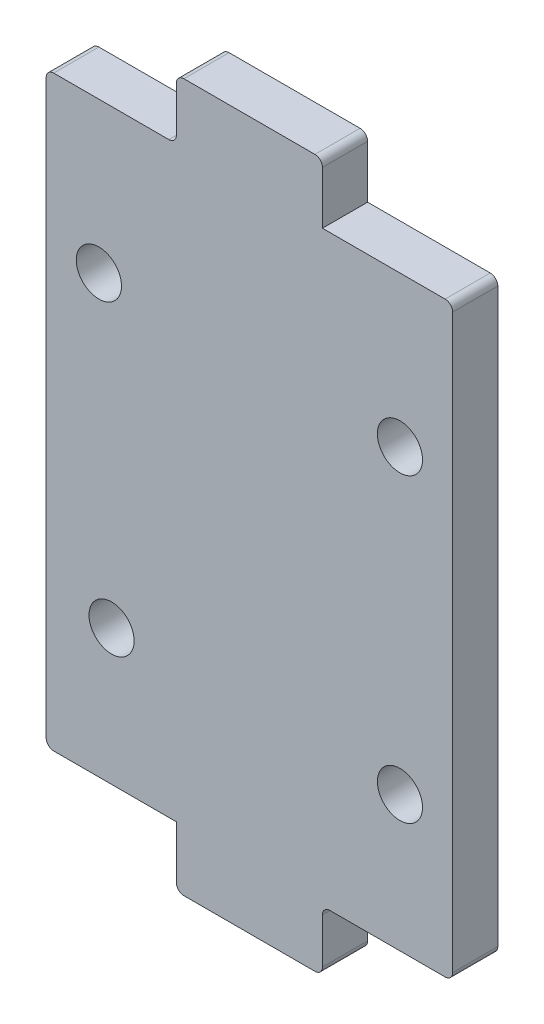
ISO-10303-21;
HEADER;
FILE_DESCRIPTION(('STEP AP214'),'2;1');
FILE_NAME('part.step','',(''),(''),'','','');
FILE_SCHEMA(('AUTOMOTIVE_DESIGN { 1 0 10303 214 1 1 1 1 }'));
ENDSEC;
DATA;
#1=APPLICATION_CONTEXT('core data for automotive mechanical design processes');
#2=APPLICATION_PROTOCOL_DEFINITION('international standard','automotive_design',2000,#1);
#3=PRODUCT_CONTEXT('',#1,'mechanical');
#4=PRODUCT('Part','Part','',(#3));
#5=PRODUCT_RELATED_PRODUCT_CATEGORY('part','',(#4));
#6=PRODUCT_DEFINITION_FORMATION('','',#4);
#7=PRODUCT_DEFINITION_CONTEXT('part definition',#1,'design');
#8=PRODUCT_DEFINITION('design','',#6,#7);
#9=PRODUCT_DEFINITION_SHAPE('','',#8);
#10=(LENGTH_UNIT() NAMED_UNIT(*) SI_UNIT(.MILLI.,.METRE.));
#11=(NAMED_UNIT(*) PLANE_ANGLE_UNIT() SI_UNIT($,.RADIAN.));
#12=(NAMED_UNIT(*) SI_UNIT($,.STERADIAN.) SOLID_ANGLE_UNIT());
#13=UNCERTAINTY_MEASURE_WITH_UNIT(LENGTH_MEASURE(1.E-05),#10,'distance_accuracy_value','');
#14=(GEOMETRIC_REPRESENTATION_CONTEXT(3) GLOBAL_UNCERTAINTY_ASSIGNED_CONTEXT((#13)) GLOBAL_UNIT_ASSIGNED_CONTEXT((#10,
#11,#12)) REPRESENTATION_CONTEXT('',''));
#15=CARTESIAN_POINT('',(0.,0.,0.));
#16=DIRECTION('',(0.,0.,1.));
#17=DIRECTION('',(1.,0.,0.));
#18=AXIS2_PLACEMENT_3D('',#15,#16,#17);
#19=CARTESIAN_POINT('',(0.,0.,3.));
#20=DIRECTION('',(0.,0.,-1.));
#21=DIRECTION('',(-1.,0.,0.));
#22=AXIS2_PLACEMENT_3D('',#19,#20,#21);
#23=PLANE('',#22);
#24=DIRECTION('',(-1.,0.,0.));
#25=VECTOR('',#24,1.);
#26=CARTESIAN_POINT('',(-13.5,19.5,3.));
#27=LINE('',#26,#25);
#28=CARTESIAN_POINT('',(-5.35133506975398,19.5,3.));
#29=VERTEX_POINT('',#28);
#30=CARTESIAN_POINT('',(-13.,19.5,3.));
#31=VERTEX_POINT('',#30);
#32=EDGE_CURVE('E234',#29,#31,#27,.T.);
#33=ORIENTED_EDGE('',*,*,#32,.T.);
#34=CARTESIAN_POINT('',(-13.,19.,3.));
#35=DIRECTION('',(0.,0.,-1.));
#36=DIRECTION('',(-1.,0.,0.));
#37=AXIS2_PLACEMENT_3D('',#34,#35,#36);
#38=CIRCLE('',#37,0.5);
#39=CARTESIAN_POINT('',(-13.5,19.,3.));
#40=VERTEX_POINT('',#39);
#41=EDGE_CURVE('E307',#31,#40,#38,.F.);
#42=ORIENTED_EDGE('',*,*,#41,.T.);
#43=DIRECTION('',(0.,-1.,0.));
#44=VECTOR('',#43,1.);
#45=CARTESIAN_POINT('',(-13.5,19.5,3.));
#46=LINE('',#45,#44);
#47=CARTESIAN_POINT('',(-13.5,-19.,3.));
#48=VERTEX_POINT('',#47);
#49=EDGE_CURVE('E194',#40,#48,#46,.T.);
#50=ORIENTED_EDGE('',*,*,#49,.T.);
#51=CARTESIAN_POINT('',(-13.,-19.,3.));
#52=DIRECTION('',(0.,0.,-1.));
#53=DIRECTION('',(-1.,0.,0.));
#54=AXIS2_PLACEMENT_3D('',#51,#52,#53);
#55=CIRCLE('',#54,0.5);
#56=CARTESIAN_POINT('',(-13.,-19.5,3.));
#57=VERTEX_POINT('',#56);
#58=EDGE_CURVE('E190',#48,#57,#55,.F.);
#59=ORIENTED_EDGE('',*,*,#58,.T.);
#60=DIRECTION('',(1.,0.,0.));
#61=VECTOR('',#60,1.);
#62=CARTESIAN_POINT('',(-4.85133506975397,-19.5,3.));
#63=LINE('',#62,#61);
#64=CARTESIAN_POINT('',(-4.85133506975397,-19.5,3.));
#65=VERTEX_POINT('',#64);
#66=EDGE_CURVE('E181',#57,#65,#63,.T.);
#67=ORIENTED_EDGE('',*,*,#66,.T.);
#68=DIRECTION('',(0.,-1.,0.));
#69=VECTOR('',#68,1.);
#70=CARTESIAN_POINT('',(-4.85133506975397,-19.5,3.));
#71=LINE('',#70,#69);
#72=CARTESIAN_POINT('',(-4.85133506975398,-23.,3.));
#73=VERTEX_POINT('',#72);
#74=EDGE_CURVE('E186',#65,#73,#71,.T.);
#75=ORIENTED_EDGE('',*,*,#74,.T.);
#76=CARTESIAN_POINT('',(-4.35133506975398,-23.,3.));
#77=DIRECTION('',(0.,0.,-1.));
#78=DIRECTION('',(-1.,0.,0.));
#79=AXIS2_PLACEMENT_3D('',#76,#77,#78);
#80=CIRCLE('',#79,0.5);
#81=CARTESIAN_POINT('',(-4.35133506975398,-23.5,3.));
#82=VERTEX_POINT('',#81);
#83=EDGE_CURVE('E301',#73,#82,#80,.F.);
#84=ORIENTED_EDGE('',*,*,#83,.T.);
#85=DIRECTION('',(1.,0.,0.));
#86=VECTOR('',#85,1.);
#87=CARTESIAN_POINT('',(-4.85133506975398,-23.5,3.));
#88=LINE('',#87,#86);
#89=CARTESIAN_POINT('',(4.35133506975397,-23.5,3.));
#90=VERTEX_POINT('',#89);
#91=EDGE_CURVE('E210',#82,#90,#88,.T.);
#92=ORIENTED_EDGE('',*,*,#91,.T.);
#93=CARTESIAN_POINT('',(4.35133506975398,-23.,3.));
#94=DIRECTION('',(0.,0.,-1.));
#95=DIRECTION('',(-1.,0.,0.));
#96=AXIS2_PLACEMENT_3D('',#93,#94,#95);
#97=CIRCLE('',#96,0.5);
#98=CARTESIAN_POINT('',(4.85133506975398,-23.,3.));
#99=VERTEX_POINT('',#98);
#100=EDGE_CURVE('E299',#90,#99,#97,.F.);
#101=ORIENTED_EDGE('',*,*,#100,.T.);
#102=DIRECTION('',(0.,1.,0.));
#103=VECTOR('',#102,1.);
#104=CARTESIAN_POINT('',(4.85133506975398,-23.5,3.));
#105=LINE('',#104,#103);
#106=CARTESIAN_POINT('',(4.85133506975397,-20.,3.));
#107=VERTEX_POINT('',#106);
#108=EDGE_CURVE('E213',#99,#107,#105,.T.);
#109=ORIENTED_EDGE('',*,*,#108,.T.);
#110=CARTESIAN_POINT('',(5.35133506975397,-20.,3.));
#111=DIRECTION('',(0.,0.,-1.));
#112=DIRECTION('',(-1.,0.,0.));
#113=AXIS2_PLACEMENT_3D('',#110,#111,#112);
#114=CIRCLE('',#113,0.5);
#115=CARTESIAN_POINT('',(5.35133506975397,-19.5,3.));
#116=VERTEX_POINT('',#115);
#117=EDGE_CURVE('E348',#107,#116,#114,.T.);
#118=ORIENTED_EDGE('',*,*,#117,.T.);
#119=DIRECTION('',(1.,0.,0.));
#120=VECTOR('',#119,1.);
#121=CARTESIAN_POINT('',(4.85133506975397,-19.5,3.));
#122=LINE('',#121,#120);
#123=CARTESIAN_POINT('',(13.,-19.5,3.));
#124=VERTEX_POINT('',#123);
#125=EDGE_CURVE('E219',#116,#124,#122,.T.);
#126=ORIENTED_EDGE('',*,*,#125,.T.);
#127=CARTESIAN_POINT('',(13.,-19.,3.));
#128=DIRECTION('',(0.,0.,-1.));
#129=DIRECTION('',(-1.,0.,0.));
#130=AXIS2_PLACEMENT_3D('',#127,#128,#129);
#131=CIRCLE('',#130,0.5);
#132=CARTESIAN_POINT('',(13.5,-19.,3.));
#133=VERTEX_POINT('',#132);
#134=EDGE_CURVE('E297',#124,#133,#131,.F.);
#135=ORIENTED_EDGE('',*,*,#134,.T.);
#136=DIRECTION('',(0.,1.,0.));
#137=VECTOR('',#136,1.);
#138=CARTESIAN_POINT('',(13.5,19.5,3.));
#139=LINE('',#138,#137);
#140=CARTESIAN_POINT('',(13.5,19.,3.));
#141=VERTEX_POINT('',#140);
#142=EDGE_CURVE('E222',#133,#141,#139,.T.);
#143=ORIENTED_EDGE('',*,*,#142,.T.);
#144=CARTESIAN_POINT('',(13.,19.,3.));
#145=DIRECTION('',(0.,0.,-1.));
#146=DIRECTION('',(-1.,0.,0.));
#147=AXIS2_PLACEMENT_3D('',#144,#145,#146);
#148=CIRCLE('',#147,0.5);
#149=CARTESIAN_POINT('',(13.,19.5,3.));
#150=VERTEX_POINT('',#149);
#151=EDGE_CURVE('E295',#141,#150,#148,.F.);
#152=ORIENTED_EDGE('',*,*,#151,.T.);
#153=DIRECTION('',(-1.,0.,0.));
#154=VECTOR('',#153,1.);
#155=CARTESIAN_POINT('',(4.85133506975398,19.5,3.));
#156=LINE('',#155,#154);
#157=CARTESIAN_POINT('',(4.85133506975398,19.5,3.));
#158=VERTEX_POINT('',#157);
#159=EDGE_CURVE('E225',#150,#158,#156,.T.);
#160=ORIENTED_EDGE('',*,*,#159,.T.);
#161=DIRECTION('',(0.,1.,0.));
#162=VECTOR('',#161,1.);
#163=CARTESIAN_POINT('',(4.85133506975397,23.5,3.));
#164=LINE('',#163,#162);
#165=CARTESIAN_POINT('',(4.85133506975397,23.,3.));
#166=VERTEX_POINT('',#165);
#167=EDGE_CURVE('E227',#158,#166,#164,.T.);
#168=ORIENTED_EDGE('',*,*,#167,.T.);
#169=CARTESIAN_POINT('',(4.35133506975397,23.,3.));
#170=DIRECTION('',(0.,0.,-1.));
#171=DIRECTION('',(-1.,0.,0.));
#172=AXIS2_PLACEMENT_3D('',#169,#170,#171);
#173=CIRCLE('',#172,0.5);
#174=CARTESIAN_POINT('',(4.35133506975397,23.5,3.));
#175=VERTEX_POINT('',#174);
#176=EDGE_CURVE('E304',#166,#175,#173,.F.);
#177=ORIENTED_EDGE('',*,*,#176,.T.);
#178=DIRECTION('',(-1.,0.,0.));
#179=VECTOR('',#178,1.);
#180=CARTESIAN_POINT('',(-4.85133506975398,23.5,3.));
#181=LINE('',#180,#179);
#182=CARTESIAN_POINT('',(-4.35133506975398,23.5,3.));
#183=VERTEX_POINT('',#182);
#184=EDGE_CURVE('E230',#175,#183,#181,.T.);
#185=ORIENTED_EDGE('',*,*,#184,.T.);
#186=CARTESIAN_POINT('',(-4.35133506975398,23.,3.));
#187=DIRECTION('',(0.,0.,-1.));
#188=DIRECTION('',(-1.,0.,0.));
#189=AXIS2_PLACEMENT_3D('',#186,#187,#188);
#190=CIRCLE('',#189,0.5);
#191=CARTESIAN_POINT('',(-4.85133506975398,23.,3.));
#192=VERTEX_POINT('',#191);
#193=EDGE_CURVE('E54',#183,#192,#190,.F.);
#194=ORIENTED_EDGE('',*,*,#193,.T.);
#195=DIRECTION('',(0.,-1.,0.));
#196=VECTOR('',#195,1.);
#197=CARTESIAN_POINT('',(-4.85133506975398,19.5,3.));
#198=LINE('',#197,#196);
#199=CARTESIAN_POINT('',(-4.85133506975398,20.,3.));
#200=VERTEX_POINT('',#199);
#201=EDGE_CURVE('E232',#192,#200,#198,.T.);
#202=ORIENTED_EDGE('',*,*,#201,.T.);
#203=CARTESIAN_POINT('',(-5.35133506975398,20.,3.));
#204=DIRECTION('',(0.,0.,-1.));
#205=DIRECTION('',(-1.,0.,0.));
#206=AXIS2_PLACEMENT_3D('',#203,#204,#205);
#207=CIRCLE('',#206,0.5);
#208=EDGE_CURVE('E11',#200,#29,#207,.T.);
#209=ORIENTED_EDGE('',*,*,#208,.T.);
#210=EDGE_LOOP('',(#33,#42,#50,#59,#67,#75,#84,#92,#101,#109,#118,#126,#135,#143,#152,#160,#168,
#177,#185,#194,#202,#209));
#211=FACE_BOUND('',#210,.T.);
#212=CARTESIAN_POINT('',(-10.,9.49999999999999,3.));
#213=DIRECTION('',(0.,0.,1.));
#214=DIRECTION('',(1.,0.,0.));
#215=AXIS2_PLACEMENT_3D('',#212,#213,#214);
#216=CIRCLE('',#215,1.5);
#217=CARTESIAN_POINT('',(-8.5,9.49999999999999,3.));
#218=VERTEX_POINT('',#217);
#219=EDGE_CURVE('E239',#218,#218,#216,.T.);
#220=ORIENTED_EDGE('',*,*,#219,.F.);
#221=EDGE_LOOP('',(#220));
#222=FACE_BOUND('',#221,.T.);
#223=CARTESIAN_POINT('',(10.,9.49999999999999,3.));
#224=DIRECTION('',(0.,0.,1.));
#225=DIRECTION('',(-1.,0.,0.));
#226=AXIS2_PLACEMENT_3D('',#223,#224,#225);
#227=CIRCLE('',#226,1.5);
#228=CARTESIAN_POINT('',(8.5,9.49999999999999,3.));
#229=VERTEX_POINT('',#228);
#230=EDGE_CURVE('E376',#229,#229,#227,.T.);
#231=ORIENTED_EDGE('',*,*,#230,.F.);
#232=EDGE_LOOP('',(#231));
#233=FACE_BOUND('',#232,.T.);
#234=CARTESIAN_POINT('',(-9.15849197894973,-10.5,3.));
#235=DIRECTION('',(0.,0.,1.));
#236=DIRECTION('',(1.,0.,0.));
#237=AXIS2_PLACEMENT_3D('',#234,#235,#236);
#238=CIRCLE('',#237,1.5);
#239=CARTESIAN_POINT('',(-7.65849197894973,-10.5,3.));
#240=VERTEX_POINT('',#239);
#241=EDGE_CURVE('E382',#240,#240,#238,.T.);
#242=ORIENTED_EDGE('',*,*,#241,.F.);
#243=EDGE_LOOP('',(#242));
#244=FACE_BOUND('',#243,.T.);
#245=CARTESIAN_POINT('',(10.,-10.5,3.));
#246=DIRECTION('',(0.,0.,1.));
#247=DIRECTION('',(-1.,0.,0.));
#248=AXIS2_PLACEMENT_3D('',#245,#246,#247);
#249=CIRCLE('',#248,1.5);
#250=CARTESIAN_POINT('',(8.5,-10.5,3.));
#251=VERTEX_POINT('',#250);
#252=EDGE_CURVE('E388',#251,#251,#249,.T.);
#253=ORIENTED_EDGE('',*,*,#252,.F.);
#254=EDGE_LOOP('',(#253));
#255=FACE_BOUND('',#254,.T.);
#256=ADVANCED_FACE('F32',(#211,#222,#233,#244,#255),#23,.F.);
#257=CARTESIAN_POINT('',(0.,0.,0.));
#258=DIRECTION('',(0.,0.,-1.));
#259=DIRECTION('',(-1.,0.,0.));
#260=AXIS2_PLACEMENT_3D('',#257,#258,#259);
#261=PLANE('',#260);
#262=CARTESIAN_POINT('',(-9.15849197894973,-10.5,0.));
#263=DIRECTION('',(0.,0.,1.));
#264=DIRECTION('',(1.,0.,0.));
#265=AXIS2_PLACEMENT_3D('',#262,#263,#264);
#266=CIRCLE('',#265,1.5);
#267=CARTESIAN_POINT('',(-7.65849197894973,-10.5,0.));
#268=VERTEX_POINT('',#267);
#269=EDGE_CURVE('E385',#268,#268,#266,.T.);
#270=ORIENTED_EDGE('',*,*,#269,.T.);
#271=EDGE_LOOP('',(#270));
#272=FACE_BOUND('',#271,.T.);
#273=CARTESIAN_POINT('',(-10.,9.49999999999999,0.));
#274=DIRECTION('',(0.,0.,1.));
#275=DIRECTION('',(1.,0.,0.));
#276=AXIS2_PLACEMENT_3D('',#273,#274,#275);
#277=CIRCLE('',#276,1.5);
#278=CARTESIAN_POINT('',(-8.5,9.49999999999999,0.));
#279=VERTEX_POINT('',#278);
#280=EDGE_CURVE('E373',#279,#279,#277,.T.);
#281=ORIENTED_EDGE('',*,*,#280,.T.);
#282=EDGE_LOOP('',(#281));
#283=FACE_BOUND('',#282,.T.);
#284=DIRECTION('',(0.,-1.,0.));
#285=VECTOR('',#284,1.);
#286=CARTESIAN_POINT('',(-13.5,19.5,0.));
#287=LINE('',#286,#285);
#288=CARTESIAN_POINT('',(-13.5,19.,0.));
#289=VERTEX_POINT('',#288);
#290=CARTESIAN_POINT('',(-13.5,-19.,0.));
#291=VERTEX_POINT('',#290);
#292=EDGE_CURVE('E236',#289,#291,#287,.T.);
#293=ORIENTED_EDGE('',*,*,#292,.F.);
#294=CARTESIAN_POINT('',(-13.,19.,0.));
#295=DIRECTION('',(0.,0.,-1.));
#296=DIRECTION('',(-1.,0.,0.));
#297=AXIS2_PLACEMENT_3D('',#294,#295,#296);
#298=CIRCLE('',#297,0.5);
#299=CARTESIAN_POINT('',(-13.,19.5,0.));
#300=VERTEX_POINT('',#299);
#301=EDGE_CURVE('E288',#289,#300,#298,.T.);
#302=ORIENTED_EDGE('',*,*,#301,.T.);
#303=DIRECTION('',(-1.,0.,0.));
#304=VECTOR('',#303,1.);
#305=CARTESIAN_POINT('',(-13.5,19.5,0.));
#306=LINE('',#305,#304);
#307=CARTESIAN_POINT('',(-5.35133506975398,19.5,0.));
#308=VERTEX_POINT('',#307);
#309=EDGE_CURVE('E265',#308,#300,#306,.T.);
#310=ORIENTED_EDGE('',*,*,#309,.F.);
#311=CARTESIAN_POINT('',(-5.35133506975398,20.,0.));
#312=DIRECTION('',(0.,0.,-1.));
#313=DIRECTION('',(-1.,0.,0.));
#314=AXIS2_PLACEMENT_3D('',#311,#312,#313);
#315=CIRCLE('',#314,0.5);
#316=CARTESIAN_POINT('',(-4.85133506975398,20.,0.));
#317=VERTEX_POINT('',#316);
#318=EDGE_CURVE('E40',#308,#317,#315,.F.);
#319=ORIENTED_EDGE('',*,*,#318,.T.);
#320=DIRECTION('',(0.,-1.,0.));
#321=VECTOR('',#320,1.);
#322=CARTESIAN_POINT('',(-4.85133506975398,19.5,0.));
#323=LINE('',#322,#321);
#324=CARTESIAN_POINT('',(-4.85133506975398,23.,0.));
#325=VERTEX_POINT('',#324);
#326=EDGE_CURVE('E263',#325,#317,#323,.T.);
#327=ORIENTED_EDGE('',*,*,#326,.F.);
#328=CARTESIAN_POINT('',(-4.35133506975398,23.,0.));
#329=DIRECTION('',(0.,0.,-1.));
#330=DIRECTION('',(-1.,0.,0.));
#331=AXIS2_PLACEMENT_3D('',#328,#329,#330);
#332=CIRCLE('',#331,0.5);
#333=CARTESIAN_POINT('',(-4.35133506975398,23.5,0.));
#334=VERTEX_POINT('',#333);
#335=EDGE_CURVE('E282',#325,#334,#332,.T.);
#336=ORIENTED_EDGE('',*,*,#335,.T.);
#337=DIRECTION('',(-1.,0.,0.));
#338=VECTOR('',#337,1.);
#339=CARTESIAN_POINT('',(-4.85133506975398,23.5,0.));
#340=LINE('',#339,#338);
#341=CARTESIAN_POINT('',(4.35133506975397,23.5,0.));
#342=VERTEX_POINT('',#341);
#343=EDGE_CURVE('E260',#342,#334,#340,.T.);
#344=ORIENTED_EDGE('',*,*,#343,.F.);
#345=CARTESIAN_POINT('',(4.35133506975397,23.,0.));
#346=DIRECTION('',(0.,0.,-1.));
#347=DIRECTION('',(-1.,0.,0.));
#348=AXIS2_PLACEMENT_3D('',#345,#346,#347);
#349=CIRCLE('',#348,0.5);
#350=CARTESIAN_POINT('',(4.85133506975397,23.,0.));
#351=VERTEX_POINT('',#350);
#352=EDGE_CURVE('E284',#342,#351,#349,.T.);
#353=ORIENTED_EDGE('',*,*,#352,.T.);
#354=DIRECTION('',(0.,1.,0.));
#355=VECTOR('',#354,1.);
#356=CARTESIAN_POINT('',(4.85133506975397,23.5,0.));
#357=LINE('',#356,#355);
#358=CARTESIAN_POINT('',(4.85133506975398,19.5,0.));
#359=VERTEX_POINT('',#358);
#360=EDGE_CURVE('E257',#359,#351,#357,.T.);
#361=ORIENTED_EDGE('',*,*,#360,.F.);
#362=DIRECTION('',(-1.,0.,0.));
#363=VECTOR('',#362,1.);
#364=CARTESIAN_POINT('',(4.85133506975398,19.5,0.));
#365=LINE('',#364,#363);
#366=CARTESIAN_POINT('',(13.,19.5,0.));
#367=VERTEX_POINT('',#366);
#368=EDGE_CURVE('E255',#367,#359,#365,.T.);
#369=ORIENTED_EDGE('',*,*,#368,.F.);
#370=CARTESIAN_POINT('',(13.,19.,0.));
#371=DIRECTION('',(0.,0.,-1.));
#372=DIRECTION('',(-1.,0.,0.));
#373=AXIS2_PLACEMENT_3D('',#370,#371,#372);
#374=CIRCLE('',#373,0.5);
#375=CARTESIAN_POINT('',(13.5,19.,0.));
#376=VERTEX_POINT('',#375);
#377=EDGE_CURVE('E274',#367,#376,#374,.T.);
#378=ORIENTED_EDGE('',*,*,#377,.T.);
#379=DIRECTION('',(0.,1.,0.));
#380=VECTOR('',#379,1.);
#381=CARTESIAN_POINT('',(13.5,19.5,0.));
#382=LINE('',#381,#380);
#383=CARTESIAN_POINT('',(13.5,-19.,0.));
#384=VERTEX_POINT('',#383);
#385=EDGE_CURVE('E252',#384,#376,#382,.T.);
#386=ORIENTED_EDGE('',*,*,#385,.F.);
#387=CARTESIAN_POINT('',(13.,-19.,0.));
#388=DIRECTION('',(0.,0.,-1.));
#389=DIRECTION('',(-1.,0.,0.));
#390=AXIS2_PLACEMENT_3D('',#387,#388,#389);
#391=CIRCLE('',#390,0.5);
#392=CARTESIAN_POINT('',(13.,-19.5,0.));
#393=VERTEX_POINT('',#392);
#394=EDGE_CURVE('E276',#384,#393,#391,.T.);
#395=ORIENTED_EDGE('',*,*,#394,.T.);
#396=DIRECTION('',(1.,0.,0.));
#397=VECTOR('',#396,1.);
#398=CARTESIAN_POINT('',(4.85133506975397,-19.5,0.));
#399=LINE('',#398,#397);
#400=CARTESIAN_POINT('',(5.35133506975397,-19.5,0.));
#401=VERTEX_POINT('',#400);
#402=EDGE_CURVE('E249',#401,#393,#399,.T.);
#403=ORIENTED_EDGE('',*,*,#402,.F.);
#404=CARTESIAN_POINT('',(5.35133506975397,-20.,0.));
#405=DIRECTION('',(0.,0.,-1.));
#406=DIRECTION('',(-1.,0.,0.));
#407=AXIS2_PLACEMENT_3D('',#404,#405,#406);
#408=CIRCLE('',#407,0.5);
#409=CARTESIAN_POINT('',(4.85133506975397,-20.,0.));
#410=VERTEX_POINT('',#409);
#411=EDGE_CURVE('E346',#401,#410,#408,.F.);
#412=ORIENTED_EDGE('',*,*,#411,.T.);
#413=DIRECTION('',(0.,1.,0.));
#414=VECTOR('',#413,1.);
#415=CARTESIAN_POINT('',(4.85133506975398,-23.5,0.));
#416=LINE('',#415,#414);
#417=CARTESIAN_POINT('',(4.85133506975398,-23.,0.));
#418=VERTEX_POINT('',#417);
#419=EDGE_CURVE('E246',#418,#410,#416,.T.);
#420=ORIENTED_EDGE('',*,*,#419,.F.);
#421=CARTESIAN_POINT('',(4.35133506975398,-23.,0.));
#422=DIRECTION('',(0.,0.,-1.));
#423=DIRECTION('',(-1.,0.,0.));
#424=AXIS2_PLACEMENT_3D('',#421,#422,#423);
#425=CIRCLE('',#424,0.5);
#426=CARTESIAN_POINT('',(4.35133506975397,-23.5,0.));
#427=VERTEX_POINT('',#426);
#428=EDGE_CURVE('E278',#418,#427,#425,.T.);
#429=ORIENTED_EDGE('',*,*,#428,.T.);
#430=DIRECTION('',(1.,0.,0.));
#431=VECTOR('',#430,1.);
#432=CARTESIAN_POINT('',(-4.85133506975398,-23.5,0.));
#433=LINE('',#432,#431);
#434=CARTESIAN_POINT('',(-4.35133506975398,-23.5,0.));
#435=VERTEX_POINT('',#434);
#436=EDGE_CURVE('E243',#435,#427,#433,.T.);
#437=ORIENTED_EDGE('',*,*,#436,.F.);
#438=CARTESIAN_POINT('',(-4.35133506975398,-23.,0.));
#439=DIRECTION('',(0.,0.,-1.));
#440=DIRECTION('',(-1.,0.,0.));
#441=AXIS2_PLACEMENT_3D('',#438,#439,#440);
#442=CIRCLE('',#441,0.5);
#443=CARTESIAN_POINT('',(-4.85133506975398,-23.,0.));
#444=VERTEX_POINT('',#443);
#445=EDGE_CURVE('E280',#435,#444,#442,.T.);
#446=ORIENTED_EDGE('',*,*,#445,.T.);
#447=DIRECTION('',(0.,-1.,0.));
#448=VECTOR('',#447,1.);
#449=CARTESIAN_POINT('',(-4.85133506975397,-19.5,0.));
#450=LINE('',#449,#448);
#451=CARTESIAN_POINT('',(-4.85133506975397,-19.5,0.));
#452=VERTEX_POINT('',#451);
#453=EDGE_CURVE('E241',#452,#444,#450,.T.);
#454=ORIENTED_EDGE('',*,*,#453,.F.);
#455=DIRECTION('',(1.,0.,0.));
#456=VECTOR('',#455,1.);
#457=CARTESIAN_POINT('',(-4.85133506975397,-19.5,0.));
#458=LINE('',#457,#456);
#459=CARTESIAN_POINT('',(-13.,-19.5,0.));
#460=VERTEX_POINT('',#459);
#461=EDGE_CURVE('E200',#460,#452,#458,.T.);
#462=ORIENTED_EDGE('',*,*,#461,.F.);
#463=CARTESIAN_POINT('',(-13.,-19.,0.));
#464=DIRECTION('',(0.,0.,-1.));
#465=DIRECTION('',(-1.,0.,0.));
#466=AXIS2_PLACEMENT_3D('',#463,#464,#465);
#467=CIRCLE('',#466,0.5);
#468=EDGE_CURVE('E286',#460,#291,#467,.T.);
#469=ORIENTED_EDGE('',*,*,#468,.T.);
#470=EDGE_LOOP('',(#293,#302,#310,#319,#327,#336,#344,#353,#361,#369,#378,#386,#395,#403,#412,
#420,#429,#437,#446,#454,#462,#469));
#471=FACE_BOUND('',#470,.T.);
#472=CARTESIAN_POINT('',(10.,9.49999999999999,0.));
#473=DIRECTION('',(0.,0.,1.));
#474=DIRECTION('',(-1.,0.,0.));
#475=AXIS2_PLACEMENT_3D('',#472,#473,#474);
#476=CIRCLE('',#475,1.5);
#477=CARTESIAN_POINT('',(8.5,9.49999999999999,0.));
#478=VERTEX_POINT('',#477);
#479=EDGE_CURVE('E379',#478,#478,#476,.T.);
#480=ORIENTED_EDGE('',*,*,#479,.T.);
#481=EDGE_LOOP('',(#480));
#482=FACE_BOUND('',#481,.T.);
#483=CARTESIAN_POINT('',(10.,-10.5,0.));
#484=DIRECTION('',(0.,0.,1.));
#485=DIRECTION('',(-1.,0.,0.));
#486=AXIS2_PLACEMENT_3D('',#483,#484,#485);
#487=CIRCLE('',#486,1.5);
#488=CARTESIAN_POINT('',(8.5,-10.5,0.));
#489=VERTEX_POINT('',#488);
#490=EDGE_CURVE('E391',#489,#489,#487,.T.);
#491=ORIENTED_EDGE('',*,*,#490,.T.);
#492=EDGE_LOOP('',(#491));
#493=FACE_BOUND('',#492,.T.);
#494=ADVANCED_FACE('F353',(#272,#283,#471,#482,#493),#261,.T.);
#495=CARTESIAN_POINT('',(-13.5,19.5,3.));
#496=DIRECTION('',(1.,0.,0.));
#497=DIRECTION('',(0.,0.,-1.));
#498=AXIS2_PLACEMENT_3D('',#495,#496,#497);
#499=PLANE('',#498);
#500=ORIENTED_EDGE('',*,*,#49,.F.);
#501=DIRECTION('',(0.,0.,-1.));
#502=VECTOR('',#501,1.);
#503=CARTESIAN_POINT('',(-13.5,19.,3.));
#504=LINE('',#503,#502);
#505=EDGE_CURVE('E271',#40,#289,#504,.T.);
#506=ORIENTED_EDGE('',*,*,#505,.T.);
#507=ORIENTED_EDGE('',*,*,#292,.T.);
#508=DIRECTION('',(0.,0.,-1.));
#509=VECTOR('',#508,1.);
#510=CARTESIAN_POINT('',(-13.5,-19.,3.));
#511=LINE('',#510,#509);
#512=EDGE_CURVE('E204',#291,#48,#511,.F.);
#513=ORIENTED_EDGE('',*,*,#512,.T.);
#514=EDGE_LOOP('',(#500,#506,#507,#513));
#515=FACE_BOUND('',#514,.T.);
#516=ADVANCED_FACE('F370',(#515),#499,.F.);
#517=CARTESIAN_POINT('',(-4.85133506975397,-19.5,3.));
#518=DIRECTION('',(0.,1.,0.));
#519=DIRECTION('',(0.,0.,1.));
#520=AXIS2_PLACEMENT_3D('',#517,#518,#519);
#521=PLANE('',#520);
#522=ORIENTED_EDGE('',*,*,#66,.F.);
#523=DIRECTION('',(0.,0.,-1.));
#524=VECTOR('',#523,1.);
#525=CARTESIAN_POINT('',(-13.,-19.5,3.));
#526=LINE('',#525,#524);
#527=EDGE_CURVE('E309',#57,#460,#526,.T.);
#528=ORIENTED_EDGE('',*,*,#527,.T.);
#529=ORIENTED_EDGE('',*,*,#461,.T.);
#530=DIRECTION('',(0.,0.,-1.));
#531=VECTOR('',#530,1.);
#532=CARTESIAN_POINT('',(-4.85133506975397,-19.5,3.));
#533=LINE('',#532,#531);
#534=EDGE_CURVE('E197',#65,#452,#533,.T.);
#535=ORIENTED_EDGE('',*,*,#534,.F.);
#536=EDGE_LOOP('',(#522,#528,#529,#535));
#537=FACE_BOUND('',#536,.T.);
#538=ADVANCED_FACE('F198',(#537),#521,.F.);
#539=CARTESIAN_POINT('',(-4.85133506975397,-19.5,3.));
#540=DIRECTION('',(1.,0.,0.));
#541=DIRECTION('',(0.,1.,0.));
#542=AXIS2_PLACEMENT_3D('',#539,#540,#541);
#543=PLANE('',#542);
#544=ORIENTED_EDGE('',*,*,#453,.T.);
#545=DIRECTION('',(0.,0.,-1.));
#546=VECTOR('',#545,1.);
#547=CARTESIAN_POINT('',(-4.85133506975398,-23.,3.));
#548=LINE('',#547,#546);
#549=EDGE_CURVE('E209',#444,#73,#548,.F.);
#550=ORIENTED_EDGE('',*,*,#549,.T.);
#551=ORIENTED_EDGE('',*,*,#74,.F.);
#552=ORIENTED_EDGE('',*,*,#534,.T.);
#553=EDGE_LOOP('',(#544,#550,#551,#552));
#554=FACE_BOUND('',#553,.T.);
#555=ADVANCED_FACE('F207',(#554),#543,.F.);
#556=CARTESIAN_POINT('',(-4.85133506975398,-23.5,3.));
#557=DIRECTION('',(0.,1.,0.));
#558=DIRECTION('',(0.,0.,1.));
#559=AXIS2_PLACEMENT_3D('',#556,#557,#558);
#560=PLANE('',#559);
#561=ORIENTED_EDGE('',*,*,#91,.F.);
#562=DIRECTION('',(0.,0.,-1.));
#563=VECTOR('',#562,1.);
#564=CARTESIAN_POINT('',(-4.35133506975398,-23.5,3.));
#565=LINE('',#564,#563);
#566=EDGE_CURVE('E324',#82,#435,#565,.T.);
#567=ORIENTED_EDGE('',*,*,#566,.T.);
#568=ORIENTED_EDGE('',*,*,#436,.T.);
#569=DIRECTION('',(0.,0.,-1.));
#570=VECTOR('',#569,1.);
#571=CARTESIAN_POINT('',(4.35133506975398,-23.5,3.));
#572=LINE('',#571,#570);
#573=EDGE_CURVE('E322',#427,#90,#572,.F.);
#574=ORIENTED_EDGE('',*,*,#573,.T.);
#575=EDGE_LOOP('',(#561,#567,#568,#574));
#576=FACE_BOUND('',#575,.T.);
#577=ADVANCED_FACE('F438',(#576),#560,.F.);
#578=CARTESIAN_POINT('',(4.85133506975398,-23.5,3.));
#579=DIRECTION('',(-1.,0.,0.));
#580=DIRECTION('',(0.,-1.,0.));
#581=AXIS2_PLACEMENT_3D('',#578,#579,#580);
#582=PLANE('',#581);
#583=ORIENTED_EDGE('',*,*,#108,.F.);
#584=DIRECTION('',(0.,0.,-1.));
#585=VECTOR('',#584,1.);
#586=CARTESIAN_POINT('',(4.85133506975398,-23.,3.));
#587=LINE('',#586,#585);
#588=EDGE_CURVE('E330',#99,#418,#587,.T.);
#589=ORIENTED_EDGE('',*,*,#588,.T.);
#590=ORIENTED_EDGE('',*,*,#419,.T.);
#591=DIRECTION('',(0.,0.,-1.));
#592=VECTOR('',#591,1.);
#593=CARTESIAN_POINT('',(4.85133506975397,-20.,3.));
#594=LINE('',#593,#592);
#595=EDGE_CURVE('E328',#410,#107,#594,.F.);
#596=ORIENTED_EDGE('',*,*,#595,.T.);
#597=EDGE_LOOP('',(#583,#589,#590,#596));
#598=FACE_BOUND('',#597,.T.);
#599=ADVANCED_FACE('F434',(#598),#582,.F.);
#600=CARTESIAN_POINT('',(4.85133506975397,-19.5,3.));
#601=DIRECTION('',(0.,1.,0.));
#602=DIRECTION('',(0.,0.,1.));
#603=AXIS2_PLACEMENT_3D('',#600,#601,#602);
#604=PLANE('',#603);
#605=ORIENTED_EDGE('',*,*,#125,.F.);
#606=DIRECTION('',(0.,0.,-1.));
#607=VECTOR('',#606,1.);
#608=CARTESIAN_POINT('',(5.35133506975397,-19.5,0.));
#609=LINE('',#608,#607);
#610=EDGE_CURVE('E335',#116,#401,#609,.T.);
#611=ORIENTED_EDGE('',*,*,#610,.T.);
#612=ORIENTED_EDGE('',*,*,#402,.T.);
#613=DIRECTION('',(0.,0.,-1.));
#614=VECTOR('',#613,1.);
#615=CARTESIAN_POINT('',(13.,-19.5,3.));
#616=LINE('',#615,#614);
#617=EDGE_CURVE('E333',#393,#124,#616,.F.);
#618=ORIENTED_EDGE('',*,*,#617,.T.);
#619=EDGE_LOOP('',(#605,#611,#612,#618));
#620=FACE_BOUND('',#619,.T.);
#621=ADVANCED_FACE('F430',(#620),#604,.F.);
#622=CARTESIAN_POINT('',(13.5,19.5,3.));
#623=DIRECTION('',(-1.,0.,0.));
#624=DIRECTION('',(0.,-1.,0.));
#625=AXIS2_PLACEMENT_3D('',#622,#623,#624);
#626=PLANE('',#625);
#627=ORIENTED_EDGE('',*,*,#142,.F.);
#628=DIRECTION('',(0.,0.,-1.));
#629=VECTOR('',#628,1.);
#630=CARTESIAN_POINT('',(13.5,-19.,3.));
#631=LINE('',#630,#629);
#632=EDGE_CURVE('E340',#133,#384,#631,.T.);
#633=ORIENTED_EDGE('',*,*,#632,.T.);
#634=ORIENTED_EDGE('',*,*,#385,.T.);
#635=DIRECTION('',(0.,0.,-1.));
#636=VECTOR('',#635,1.);
#637=CARTESIAN_POINT('',(13.5,19.,3.));
#638=LINE('',#637,#636);
#639=EDGE_CURVE('E338',#376,#141,#638,.F.);
#640=ORIENTED_EDGE('',*,*,#639,.T.);
#641=EDGE_LOOP('',(#627,#633,#634,#640));
#642=FACE_BOUND('',#641,.T.);
#643=ADVANCED_FACE('F426',(#642),#626,.F.);
#644=CARTESIAN_POINT('',(4.85133506975398,19.5,3.));
#645=DIRECTION('',(0.,-1.,0.));
#646=DIRECTION('',(0.,0.,-1.));
#647=AXIS2_PLACEMENT_3D('',#644,#645,#646);
#648=PLANE('',#647);
#649=ORIENTED_EDGE('',*,*,#159,.F.);
#650=DIRECTION('',(0.,0.,-1.));
#651=VECTOR('',#650,1.);
#652=CARTESIAN_POINT('',(13.,19.5,3.));
#653=LINE('',#652,#651);
#654=EDGE_CURVE('E343',#150,#367,#653,.T.);
#655=ORIENTED_EDGE('',*,*,#654,.T.);
#656=ORIENTED_EDGE('',*,*,#368,.T.);
#657=DIRECTION('',(0.,0.,-1.));
#658=VECTOR('',#657,1.);
#659=CARTESIAN_POINT('',(4.85133506975398,19.5,3.));
#660=LINE('',#659,#658);
#661=EDGE_CURVE('E205',#158,#359,#660,.T.);
#662=ORIENTED_EDGE('',*,*,#661,.F.);
#663=EDGE_LOOP('',(#649,#655,#656,#662));
#664=FACE_BOUND('',#663,.T.);
#665=ADVANCED_FACE('F422',(#664),#648,.F.);
#666=CARTESIAN_POINT('',(4.85133506975397,23.5,3.));
#667=DIRECTION('',(-1.,0.,0.));
#668=DIRECTION('',(0.,-1.,0.));
#669=AXIS2_PLACEMENT_3D('',#666,#667,#668);
#670=PLANE('',#669);
#671=ORIENTED_EDGE('',*,*,#360,.T.);
#672=DIRECTION('',(0.,0.,-1.));
#673=VECTOR('',#672,1.);
#674=CARTESIAN_POINT('',(4.85133506975397,23.,3.));
#675=LINE('',#674,#673);
#676=EDGE_CURVE('E316',#351,#166,#675,.F.);
#677=ORIENTED_EDGE('',*,*,#676,.T.);
#678=ORIENTED_EDGE('',*,*,#167,.F.);
#679=ORIENTED_EDGE('',*,*,#661,.T.);
#680=EDGE_LOOP('',(#671,#677,#678,#679));
#681=FACE_BOUND('',#680,.T.);
#682=ADVANCED_FACE('F418',(#681),#670,.F.);
#683=CARTESIAN_POINT('',(-4.85133506975398,23.5,3.));
#684=DIRECTION('',(0.,-1.,0.));
#685=DIRECTION('',(0.,0.,-1.));
#686=AXIS2_PLACEMENT_3D('',#683,#684,#685);
#687=PLANE('',#686);
#688=ORIENTED_EDGE('',*,*,#184,.F.);
#689=DIRECTION('',(0.,0.,-1.));
#690=VECTOR('',#689,1.);
#691=CARTESIAN_POINT('',(4.35133506975397,23.5,3.));
#692=LINE('',#691,#690);
#693=EDGE_CURVE('E313',#175,#342,#692,.T.);
#694=ORIENTED_EDGE('',*,*,#693,.T.);
#695=ORIENTED_EDGE('',*,*,#343,.T.);
#696=DIRECTION('',(0.,0.,-1.));
#697=VECTOR('',#696,1.);
#698=CARTESIAN_POINT('',(-4.35133506975398,23.5,3.));
#699=LINE('',#698,#697);
#700=EDGE_CURVE('E311',#334,#183,#699,.F.);
#701=ORIENTED_EDGE('',*,*,#700,.T.);
#702=EDGE_LOOP('',(#688,#694,#695,#701));
#703=FACE_BOUND('',#702,.T.);
#704=ADVANCED_FACE('F415',(#703),#687,.F.);
#705=CARTESIAN_POINT('',(-4.85133506975398,19.5,3.));
#706=DIRECTION('',(1.,0.,0.));
#707=DIRECTION('',(0.,1.,0.));
#708=AXIS2_PLACEMENT_3D('',#705,#706,#707);
#709=PLANE('',#708);
#710=ORIENTED_EDGE('',*,*,#201,.F.);
#711=DIRECTION('',(0.,0.,-1.));
#712=VECTOR('',#711,1.);
#713=CARTESIAN_POINT('',(-4.85133506975398,23.,3.));
#714=LINE('',#713,#712);
#715=EDGE_CURVE('E319',#192,#325,#714,.T.);
#716=ORIENTED_EDGE('',*,*,#715,.T.);
#717=ORIENTED_EDGE('',*,*,#326,.T.);
#718=DIRECTION('',(0.,0.,-1.));
#719=VECTOR('',#718,1.);
#720=CARTESIAN_POINT('',(-4.85133506975398,20.,3.));
#721=LINE('',#720,#719);
#722=EDGE_CURVE('E47',#317,#200,#721,.F.);
#723=ORIENTED_EDGE('',*,*,#722,.T.);
#724=EDGE_LOOP('',(#710,#716,#717,#723));
#725=FACE_BOUND('',#724,.T.);
#726=ADVANCED_FACE('F357',(#725),#709,.F.);
#727=CARTESIAN_POINT('',(-13.5,19.5,3.));
#728=DIRECTION('',(0.,-1.,0.));
#729=DIRECTION('',(0.,0.,-1.));
#730=AXIS2_PLACEMENT_3D('',#727,#728,#729);
#731=PLANE('',#730);
#732=ORIENTED_EDGE('',*,*,#309,.T.);
#733=DIRECTION('',(0.,0.,-1.));
#734=VECTOR('',#733,1.);
#735=CARTESIAN_POINT('',(-13.,19.5,3.));
#736=LINE('',#735,#734);
#737=EDGE_CURVE('E293',#300,#31,#736,.F.);
#738=ORIENTED_EDGE('',*,*,#737,.T.);
#739=ORIENTED_EDGE('',*,*,#32,.F.);
#740=DIRECTION('',(0.,0.,-1.));
#741=VECTOR('',#740,1.);
#742=CARTESIAN_POINT('',(-5.35133506975398,19.5,0.));
#743=LINE('',#742,#741);
#744=EDGE_CURVE('E290',#29,#308,#743,.T.);
#745=ORIENTED_EDGE('',*,*,#744,.T.);
#746=EDGE_LOOP('',(#732,#738,#739,#745));
#747=FACE_BOUND('',#746,.T.);
#748=ADVANCED_FACE('F363',(#747),#731,.F.);
#749=CARTESIAN_POINT('',(-10.,9.49999999999999,3.));
#750=DIRECTION('',(0.,0.,-1.));
#751=DIRECTION('',(-1.,0.,0.));
#752=AXIS2_PLACEMENT_3D('',#749,#750,#751);
#753=CYLINDRICAL_SURFACE('',#752,1.5);
#754=ORIENTED_EDGE('',*,*,#219,.T.);
#755=EDGE_LOOP('',(#754));
#756=FACE_BOUND('',#755,.T.);
#757=ORIENTED_EDGE('',*,*,#280,.F.);
#758=EDGE_LOOP('',(#757));
#759=FACE_BOUND('',#758,.T.);
#760=ADVANCED_FACE('F408',(#756,#759),#753,.F.);
#761=CARTESIAN_POINT('',(10.,9.49999999999999,3.));
#762=DIRECTION('',(0.,0.,-1.));
#763=DIRECTION('',(-1.,0.,0.));
#764=AXIS2_PLACEMENT_3D('',#761,#762,#763);
#765=CYLINDRICAL_SURFACE('',#764,1.5);
#766=ORIENTED_EDGE('',*,*,#230,.T.);
#767=EDGE_LOOP('',(#766));
#768=FACE_BOUND('',#767,.T.);
#769=ORIENTED_EDGE('',*,*,#479,.F.);
#770=EDGE_LOOP('',(#769));
#771=FACE_BOUND('',#770,.T.);
#772=ADVANCED_FACE('F672',(#768,#771),#765,.F.);
#773=CARTESIAN_POINT('',(-9.15849197894973,-10.5,3.));
#774=DIRECTION('',(0.,0.,-1.));
#775=DIRECTION('',(-1.,0.,0.));
#776=AXIS2_PLACEMENT_3D('',#773,#774,#775);
#777=CYLINDRICAL_SURFACE('',#776,1.5);
#778=ORIENTED_EDGE('',*,*,#241,.T.);
#779=EDGE_LOOP('',(#778));
#780=FACE_BOUND('',#779,.T.);
#781=ORIENTED_EDGE('',*,*,#269,.F.);
#782=EDGE_LOOP('',(#781));
#783=FACE_BOUND('',#782,.T.);
#784=ADVANCED_FACE('F663',(#780,#783),#777,.F.);
#785=CARTESIAN_POINT('',(10.,-10.5,3.));
#786=DIRECTION('',(0.,0.,-1.));
#787=DIRECTION('',(-1.,0.,0.));
#788=AXIS2_PLACEMENT_3D('',#785,#786,#787);
#789=CYLINDRICAL_SURFACE('',#788,1.5);
#790=ORIENTED_EDGE('',*,*,#252,.T.);
#791=EDGE_LOOP('',(#790));
#792=FACE_BOUND('',#791,.T.);
#793=ORIENTED_EDGE('',*,*,#490,.F.);
#794=EDGE_LOOP('',(#793));
#795=FACE_BOUND('',#794,.T.);
#796=ADVANCED_FACE('F397',(#792,#795),#789,.F.);
#797=CARTESIAN_POINT('',(-13.,19.,3.));
#798=DIRECTION('',(0.,0.,-1.));
#799=DIRECTION('',(-1.,0.,0.));
#800=AXIS2_PLACEMENT_3D('',#797,#798,#799);
#801=CYLINDRICAL_SURFACE('',#800,0.5);
#802=ORIENTED_EDGE('',*,*,#41,.F.);
#803=ORIENTED_EDGE('',*,*,#737,.F.);
#804=ORIENTED_EDGE('',*,*,#301,.F.);
#805=ORIENTED_EDGE('',*,*,#505,.F.);
#806=EDGE_LOOP('',(#802,#803,#804,#805));
#807=FACE_BOUND('',#806,.T.);
#808=ADVANCED_FACE('F366',(#807),#801,.T.);
#809=CARTESIAN_POINT('',(-13.,-19.,3.));
#810=DIRECTION('',(0.,0.,-1.));
#811=DIRECTION('',(-1.,0.,0.));
#812=AXIS2_PLACEMENT_3D('',#809,#810,#811);
#813=CYLINDRICAL_SURFACE('',#812,0.5);
#814=ORIENTED_EDGE('',*,*,#58,.F.);
#815=ORIENTED_EDGE('',*,*,#512,.F.);
#816=ORIENTED_EDGE('',*,*,#468,.F.);
#817=ORIENTED_EDGE('',*,*,#527,.F.);
#818=EDGE_LOOP('',(#814,#815,#816,#817));
#819=FACE_BOUND('',#818,.T.);
#820=ADVANCED_FACE('F451',(#819),#813,.T.);
#821=CARTESIAN_POINT('',(4.35133506975397,23.,3.));
#822=DIRECTION('',(0.,0.,-1.));
#823=DIRECTION('',(-1.,0.,0.));
#824=AXIS2_PLACEMENT_3D('',#821,#822,#823);
#825=CYLINDRICAL_SURFACE('',#824,0.5);
#826=ORIENTED_EDGE('',*,*,#176,.F.);
#827=ORIENTED_EDGE('',*,*,#676,.F.);
#828=ORIENTED_EDGE('',*,*,#352,.F.);
#829=ORIENTED_EDGE('',*,*,#693,.F.);
#830=EDGE_LOOP('',(#826,#827,#828,#829));
#831=FACE_BOUND('',#830,.T.);
#832=ADVANCED_FACE('F454',(#831),#825,.T.);
#833=CARTESIAN_POINT('',(-4.35133506975398,23.,3.));
#834=DIRECTION('',(0.,0.,-1.));
#835=DIRECTION('',(-1.,0.,0.));
#836=AXIS2_PLACEMENT_3D('',#833,#834,#835);
#837=CYLINDRICAL_SURFACE('',#836,0.5);
#838=ORIENTED_EDGE('',*,*,#193,.F.);
#839=ORIENTED_EDGE('',*,*,#700,.F.);
#840=ORIENTED_EDGE('',*,*,#335,.F.);
#841=ORIENTED_EDGE('',*,*,#715,.F.);
#842=EDGE_LOOP('',(#838,#839,#840,#841));
#843=FACE_BOUND('',#842,.T.);
#844=ADVANCED_FACE('F458',(#843),#837,.T.);
#845=CARTESIAN_POINT('',(-4.35133506975398,-23.,3.));
#846=DIRECTION('',(0.,0.,-1.));
#847=DIRECTION('',(-1.,0.,0.));
#848=AXIS2_PLACEMENT_3D('',#845,#846,#847);
#849=CYLINDRICAL_SURFACE('',#848,0.5);
#850=ORIENTED_EDGE('',*,*,#83,.F.);
#851=ORIENTED_EDGE('',*,*,#549,.F.);
#852=ORIENTED_EDGE('',*,*,#445,.F.);
#853=ORIENTED_EDGE('',*,*,#566,.F.);
#854=EDGE_LOOP('',(#850,#851,#852,#853));
#855=FACE_BOUND('',#854,.T.);
#856=ADVANCED_FACE('F462',(#855),#849,.T.);
#857=CARTESIAN_POINT('',(4.35133506975398,-23.,3.));
#858=DIRECTION('',(0.,0.,-1.));
#859=DIRECTION('',(-1.,0.,0.));
#860=AXIS2_PLACEMENT_3D('',#857,#858,#859);
#861=CYLINDRICAL_SURFACE('',#860,0.5);
#862=ORIENTED_EDGE('',*,*,#100,.F.);
#863=ORIENTED_EDGE('',*,*,#573,.F.);
#864=ORIENTED_EDGE('',*,*,#428,.F.);
#865=ORIENTED_EDGE('',*,*,#588,.F.);
#866=EDGE_LOOP('',(#862,#863,#864,#865));
#867=FACE_BOUND('',#866,.T.);
#868=ADVANCED_FACE('F466',(#867),#861,.T.);
#869=CARTESIAN_POINT('',(5.35133506975397,-20.,3.));
#870=DIRECTION('',(0.,0.,1.));
#871=DIRECTION('',(1.,0.,0.));
#872=AXIS2_PLACEMENT_3D('',#869,#870,#871);
#873=CYLINDRICAL_SURFACE('',#872,0.5);
#874=ORIENTED_EDGE('',*,*,#117,.F.);
#875=ORIENTED_EDGE('',*,*,#595,.F.);
#876=ORIENTED_EDGE('',*,*,#411,.F.);
#877=ORIENTED_EDGE('',*,*,#610,.F.);
#878=EDGE_LOOP('',(#874,#875,#876,#877));
#879=FACE_BOUND('',#878,.T.);
#880=ADVANCED_FACE('F470',(#879),#873,.F.);
#881=CARTESIAN_POINT('',(13.,-19.,3.));
#882=DIRECTION('',(0.,0.,-1.));
#883=DIRECTION('',(-1.,0.,0.));
#884=AXIS2_PLACEMENT_3D('',#881,#882,#883);
#885=CYLINDRICAL_SURFACE('',#884,0.5);
#886=ORIENTED_EDGE('',*,*,#134,.F.);
#887=ORIENTED_EDGE('',*,*,#617,.F.);
#888=ORIENTED_EDGE('',*,*,#394,.F.);
#889=ORIENTED_EDGE('',*,*,#632,.F.);
#890=EDGE_LOOP('',(#886,#887,#888,#889));
#891=FACE_BOUND('',#890,.T.);
#892=ADVANCED_FACE('F474',(#891),#885,.T.);
#893=CARTESIAN_POINT('',(13.,19.,3.));
#894=DIRECTION('',(0.,0.,-1.));
#895=DIRECTION('',(-1.,0.,0.));
#896=AXIS2_PLACEMENT_3D('',#893,#894,#895);
#897=CYLINDRICAL_SURFACE('',#896,0.5);
#898=ORIENTED_EDGE('',*,*,#151,.F.);
#899=ORIENTED_EDGE('',*,*,#639,.F.);
#900=ORIENTED_EDGE('',*,*,#377,.F.);
#901=ORIENTED_EDGE('',*,*,#654,.F.);
#902=EDGE_LOOP('',(#898,#899,#900,#901));
#903=FACE_BOUND('',#902,.T.);
#904=ADVANCED_FACE('F477',(#903),#897,.T.);
#905=CARTESIAN_POINT('',(-5.35133506975398,20.,3.));
#906=DIRECTION('',(0.,0.,1.));
#907=DIRECTION('',(1.,0.,0.));
#908=AXIS2_PLACEMENT_3D('',#905,#906,#907);
#909=CYLINDRICAL_SURFACE('',#908,0.5);
#910=ORIENTED_EDGE('',*,*,#208,.F.);
#911=ORIENTED_EDGE('',*,*,#722,.F.);
#912=ORIENTED_EDGE('',*,*,#318,.F.);
#913=ORIENTED_EDGE('',*,*,#744,.F.);
#914=EDGE_LOOP('',(#910,#911,#912,#913));
#915=FACE_BOUND('',#914,.T.);
#916=ADVANCED_FACE('F34',(#915),#909,.F.);
#917=CLOSED_SHELL('',(#256,#494,#516,#538,#555,#577,#599,#621,#643,#665,#682,#704,#726,#748,
#760,#772,#784,#796,#808,#820,#832,#844,#856,#868,#880,#892,#904,#916));
#918=MANIFOLD_SOLID_BREP('B2',#917);
#919=ADVANCED_BREP_SHAPE_REPRESENTATION('',(#18,#918),#14);
#920=SHAPE_DEFINITION_REPRESENTATION(#9,#919);
ENDSEC;
END-ISO-10303-21;
